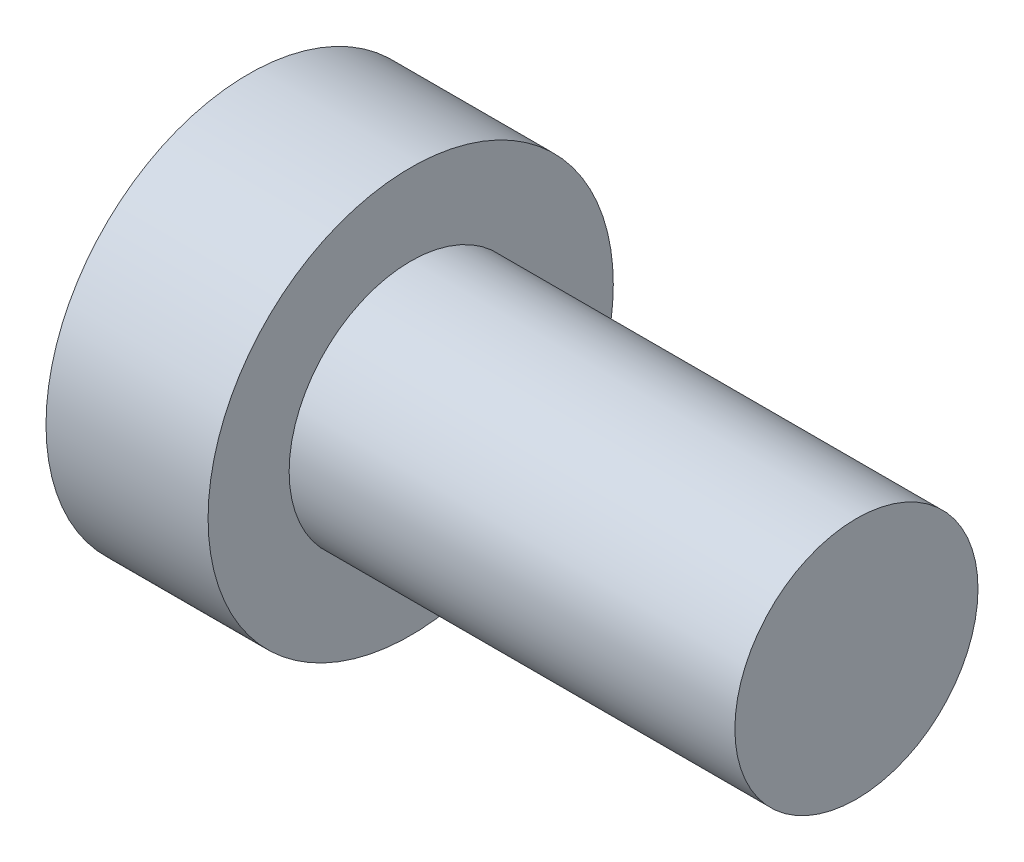
ISO-10303-21;
HEADER;
FILE_DESCRIPTION(('STEP AP214'),'2;1');
FILE_NAME('part.step','',(''),(''),'','','');
FILE_SCHEMA(('AUTOMOTIVE_DESIGN { 1 0 10303 214 1 1 1 1 }'));
ENDSEC;
DATA;
#1=APPLICATION_CONTEXT('core data for automotive mechanical design processes');
#2=APPLICATION_PROTOCOL_DEFINITION('international standard','automotive_design',2000,#1);
#3=PRODUCT_CONTEXT('',#1,'mechanical');
#4=PRODUCT('Part','Part','',(#3));
#5=PRODUCT_RELATED_PRODUCT_CATEGORY('part','',(#4));
#6=PRODUCT_DEFINITION_FORMATION('','',#4);
#7=PRODUCT_DEFINITION_CONTEXT('part definition',#1,'design');
#8=PRODUCT_DEFINITION('design','',#6,#7);
#9=PRODUCT_DEFINITION_SHAPE('','',#8);
#10=(LENGTH_UNIT() NAMED_UNIT(*) SI_UNIT(.MILLI.,.METRE.));
#11=(NAMED_UNIT(*) PLANE_ANGLE_UNIT() SI_UNIT($,.RADIAN.));
#12=(NAMED_UNIT(*) SI_UNIT($,.STERADIAN.) SOLID_ANGLE_UNIT());
#13=UNCERTAINTY_MEASURE_WITH_UNIT(LENGTH_MEASURE(1.E-05),#10,'distance_accuracy_value','');
#14=(GEOMETRIC_REPRESENTATION_CONTEXT(3) GLOBAL_UNCERTAINTY_ASSIGNED_CONTEXT((#13)) GLOBAL_UNIT_ASSIGNED_CONTEXT((#10,
#11,#12)) REPRESENTATION_CONTEXT('',''));
#15=CARTESIAN_POINT('',(0.,0.,0.));
#16=DIRECTION('',(0.,0.,1.));
#17=DIRECTION('',(1.,0.,0.));
#18=AXIS2_PLACEMENT_3D('',#15,#16,#17);
#19=CARTESIAN_POINT('',(7.5,0.,0.));
#20=DIRECTION('',(-1.,0.,0.));
#21=DIRECTION('',(0.,0.,1.));
#22=AXIS2_PLACEMENT_3D('',#19,#20,#21);
#23=PLANE('',#22);
#24=CARTESIAN_POINT('',(7.5,0.,0.));
#25=DIRECTION('',(-1.,0.,0.));
#26=DIRECTION('',(0.,0.,1.));
#27=AXIS2_PLACEMENT_3D('',#24,#25,#26);
#28=CIRCLE('',#27,1.5);
#29=CARTESIAN_POINT('',(7.5,0.,1.5));
#30=VERTEX_POINT('',#29);
#31=EDGE_CURVE('E10',#30,#30,#28,.T.);
#32=ORIENTED_EDGE('',*,*,#31,.F.);
#33=EDGE_LOOP('',(#32));
#34=FACE_BOUND('',#33,.T.);
#35=ADVANCED_FACE('F37',(#34),#23,.F.);
#36=CARTESIAN_POINT('',(0.,0.,0.));
#37=DIRECTION('',(-1.,0.,0.));
#38=DIRECTION('',(0.,0.,1.));
#39=AXIS2_PLACEMENT_3D('',#36,#37,#38);
#40=CYLINDRICAL_SURFACE('',#39,1.5);
#41=CARTESIAN_POINT('',(2.,0.,0.));
#42=DIRECTION('',(-1.,0.,0.));
#43=DIRECTION('',(0.,0.,1.));
#44=AXIS2_PLACEMENT_3D('',#41,#42,#43);
#45=CIRCLE('',#44,1.5);
#46=CARTESIAN_POINT('',(2.,0.,1.5));
#47=VERTEX_POINT('',#46);
#48=EDGE_CURVE('E43',#47,#47,#45,.T.);
#49=ORIENTED_EDGE('',*,*,#48,.F.);
#50=EDGE_LOOP('',(#49));
#51=FACE_BOUND('',#50,.T.);
#52=ORIENTED_EDGE('',*,*,#31,.T.);
#53=EDGE_LOOP('',(#52));
#54=FACE_BOUND('',#53,.T.);
#55=ADVANCED_FACE('F67',(#51,#54),#40,.T.);
#56=CARTESIAN_POINT('',(2.,1.5,0.));
#57=DIRECTION('',(-1.,0.,0.));
#58=DIRECTION('',(0.,0.,1.));
#59=AXIS2_PLACEMENT_3D('',#56,#57,#58);
#60=PLANE('',#59);
#61=CARTESIAN_POINT('',(2.,0.,0.));
#62=DIRECTION('',(-1.,0.,0.));
#63=DIRECTION('',(0.,0.,1.));
#64=AXIS2_PLACEMENT_3D('',#61,#62,#63);
#65=CIRCLE('',#64,2.5);
#66=CARTESIAN_POINT('',(2.,0.,2.5));
#67=VERTEX_POINT('',#66);
#68=EDGE_CURVE('E47',#67,#67,#65,.T.);
#69=ORIENTED_EDGE('',*,*,#68,.F.);
#70=EDGE_LOOP('',(#69));
#71=FACE_BOUND('',#70,.T.);
#72=ORIENTED_EDGE('',*,*,#48,.T.);
#73=EDGE_LOOP('',(#72));
#74=FACE_BOUND('',#73,.T.);
#75=ADVANCED_FACE('F62',(#71,#74),#60,.F.);
#76=CARTESIAN_POINT('',(0.,0.,0.));
#77=DIRECTION('',(-1.,0.,0.));
#78=DIRECTION('',(0.,0.,1.));
#79=AXIS2_PLACEMENT_3D('',#76,#77,#78);
#80=CYLINDRICAL_SURFACE('',#79,2.5);
#81=CARTESIAN_POINT('',(0.,0.,0.));
#82=DIRECTION('',(-1.,0.,0.));
#83=DIRECTION('',(0.,0.,1.));
#84=AXIS2_PLACEMENT_3D('',#81,#82,#83);
#85=CIRCLE('',#84,2.5);
#86=CARTESIAN_POINT('',(0.,0.,2.5));
#87=VERTEX_POINT('',#86);
#88=EDGE_CURVE('E51',#87,#87,#85,.T.);
#89=ORIENTED_EDGE('',*,*,#88,.F.);
#90=EDGE_LOOP('',(#89));
#91=FACE_BOUND('',#90,.T.);
#92=ORIENTED_EDGE('',*,*,#68,.T.);
#93=EDGE_LOOP('',(#92));
#94=FACE_BOUND('',#93,.T.);
#95=ADVANCED_FACE('F59',(#91,#94),#80,.T.);
#96=CARTESIAN_POINT('',(0.,2.5,0.));
#97=DIRECTION('',(1.,0.,0.));
#98=DIRECTION('',(0.,0.,-1.));
#99=AXIS2_PLACEMENT_3D('',#96,#97,#98);
#100=PLANE('',#99);
#101=ORIENTED_EDGE('',*,*,#88,.T.);
#102=EDGE_LOOP('',(#101));
#103=FACE_BOUND('',#102,.T.);
#104=ADVANCED_FACE('F57',(#103),#100,.F.);
#105=CLOSED_SHELL('',(#35,#55,#75,#95,#104));
#106=MANIFOLD_SOLID_BREP('B2',#105);
#107=ADVANCED_BREP_SHAPE_REPRESENTATION('',(#18,#106),#14);
#108=SHAPE_DEFINITION_REPRESENTATION(#9,#107);
ENDSEC;
END-ISO-10303-21;
